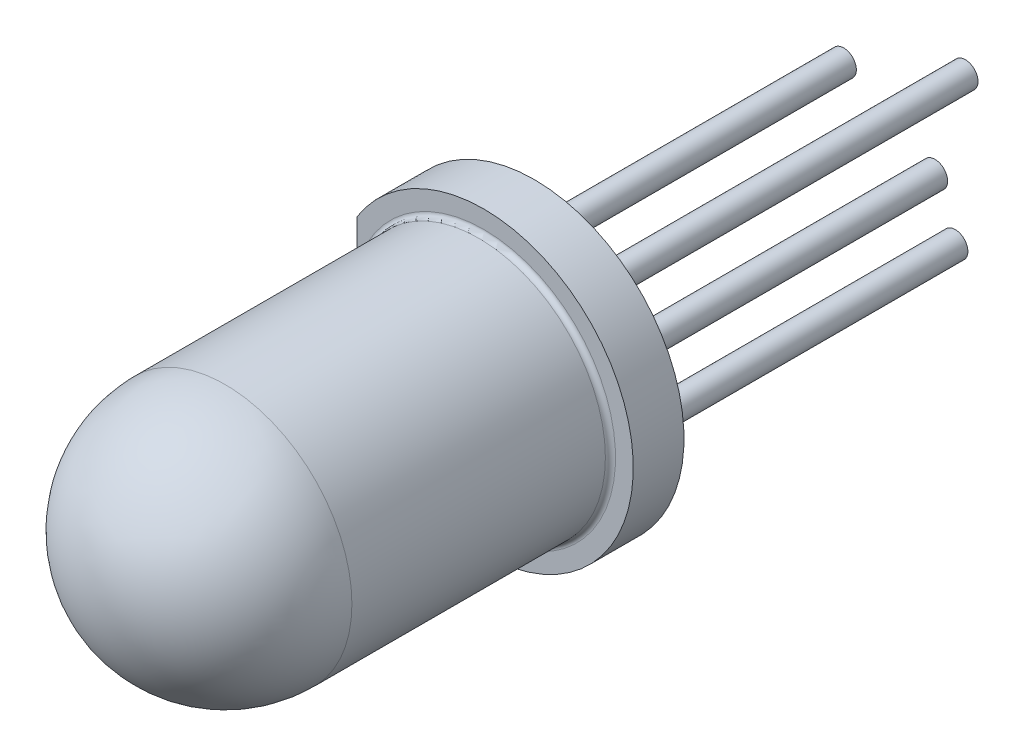
ISO-10303-21;
HEADER;
FILE_DESCRIPTION(('STEP AP214'),'2;1');
FILE_NAME('part.step','',(''),(''),'','','');
FILE_SCHEMA(('AUTOMOTIVE_DESIGN { 1 0 10303 214 1 1 1 1 }'));
ENDSEC;
DATA;
#1=APPLICATION_CONTEXT('core data for automotive mechanical design processes');
#2=APPLICATION_PROTOCOL_DEFINITION('international standard','automotive_design',2000,#1);
#3=PRODUCT_CONTEXT('',#1,'mechanical');
#4=PRODUCT('Part','Part','',(#3));
#5=PRODUCT_RELATED_PRODUCT_CATEGORY('part','',(#4));
#6=PRODUCT_DEFINITION_FORMATION('','',#4);
#7=PRODUCT_DEFINITION_CONTEXT('part definition',#1,'design');
#8=PRODUCT_DEFINITION('design','',#6,#7);
#9=PRODUCT_DEFINITION_SHAPE('','',#8);
#10=(LENGTH_UNIT() NAMED_UNIT(*) SI_UNIT(.MILLI.,.METRE.));
#11=(NAMED_UNIT(*) PLANE_ANGLE_UNIT() SI_UNIT($,.RADIAN.));
#12=(NAMED_UNIT(*) SI_UNIT($,.STERADIAN.) SOLID_ANGLE_UNIT());
#13=UNCERTAINTY_MEASURE_WITH_UNIT(LENGTH_MEASURE(1.E-05),#10,'distance_accuracy_value','');
#14=(GEOMETRIC_REPRESENTATION_CONTEXT(3) GLOBAL_UNCERTAINTY_ASSIGNED_CONTEXT((#13)) GLOBAL_UNIT_ASSIGNED_CONTEXT((#10,
#11,#12)) REPRESENTATION_CONTEXT('',''));
#15=CARTESIAN_POINT('',(0.,0.,0.));
#16=DIRECTION('',(0.,0.,1.));
#17=DIRECTION('',(1.,0.,0.));
#18=AXIS2_PLACEMENT_3D('',#15,#16,#17);
#19=CARTESIAN_POINT('',(-1.9,0.,-9.));
#20=DIRECTION('',(0.,0.,1.));
#21=DIRECTION('',(1.,0.,0.));
#22=AXIS2_PLACEMENT_3D('',#19,#20,#21);
#23=PLANE('',#22);
#24=CARTESIAN_POINT('',(-1.9,0.,-9.));
#25=DIRECTION('',(0.,0.,-1.));
#26=DIRECTION('',(-1.,0.,0.));
#27=AXIS2_PLACEMENT_3D('',#24,#25,#26);
#28=CIRCLE('',#27,0.25);
#29=CARTESIAN_POINT('',(-2.15,0.,-9.));
#30=VERTEX_POINT('',#29);
#31=EDGE_CURVE('E23',#30,#30,#28,.F.);
#32=ORIENTED_EDGE('',*,*,#31,.F.);
#33=EDGE_LOOP('',(#32));
#34=FACE_BOUND('',#33,.T.);
#35=ADVANCED_FACE('F16',(#34),#23,.F.);
#36=CARTESIAN_POINT('',(-0.500000688156753,-0.00138810605967266,-10.));
#37=DIRECTION('',(0.,0.,1.));
#38=DIRECTION('',(1.,0.,0.));
#39=AXIS2_PLACEMENT_3D('',#36,#37,#38);
#40=PLANE('',#39);
#41=CARTESIAN_POINT('',(-0.500000688156752,-0.00138810605967266,-10.));
#42=DIRECTION('',(0.,0.,-1.));
#43=DIRECTION('',(-1.,0.,0.));
#44=AXIS2_PLACEMENT_3D('',#41,#42,#43);
#45=CIRCLE('',#44,0.25);
#46=CARTESIAN_POINT('',(-0.750000688156752,-0.00138810605967266,-10.));
#47=VERTEX_POINT('',#46);
#48=EDGE_CURVE('E149',#47,#47,#45,.F.);
#49=ORIENTED_EDGE('',*,*,#48,.F.);
#50=EDGE_LOOP('',(#49));
#51=FACE_BOUND('',#50,.T.);
#52=ADVANCED_FACE('F220',(#51),#40,.F.);
#53=CARTESIAN_POINT('',(0.899998623686495,-0.00277621211934524,-8.));
#54=DIRECTION('',(0.,0.,1.));
#55=DIRECTION('',(1.,0.,0.));
#56=AXIS2_PLACEMENT_3D('',#53,#54,#55);
#57=PLANE('',#56);
#58=CARTESIAN_POINT('',(0.899998623686495,-0.00277621211934524,-8.));
#59=DIRECTION('',(0.,0.,-1.));
#60=DIRECTION('',(-1.,0.,0.));
#61=AXIS2_PLACEMENT_3D('',#58,#59,#60);
#62=CIRCLE('',#61,0.25);
#63=CARTESIAN_POINT('',(0.649998623686495,-0.00277621211934524,-8.));
#64=VERTEX_POINT('',#63);
#65=EDGE_CURVE('E147',#64,#64,#62,.F.);
#66=ORIENTED_EDGE('',*,*,#65,.F.);
#67=EDGE_LOOP('',(#66));
#68=FACE_BOUND('',#67,.T.);
#69=ADVANCED_FACE('F224',(#68),#57,.F.);
#70=CARTESIAN_POINT('',(2.29999862368649,-0.00277621211934511,-7.));
#71=DIRECTION('',(0.,0.,1.));
#72=DIRECTION('',(1.,0.,0.));
#73=AXIS2_PLACEMENT_3D('',#70,#71,#72);
#74=PLANE('',#73);
#75=CARTESIAN_POINT('',(2.29999862368649,-0.0027762121193451,-7.));
#76=DIRECTION('',(0.,0.,-1.));
#77=DIRECTION('',(-1.,0.,0.));
#78=AXIS2_PLACEMENT_3D('',#75,#76,#77);
#79=CIRCLE('',#78,0.25);
#80=CARTESIAN_POINT('',(2.04999862368649,-0.0027762121193451,-7.));
#81=VERTEX_POINT('',#80);
#82=EDGE_CURVE('E144',#81,#81,#79,.F.);
#83=ORIENTED_EDGE('',*,*,#82,.F.);
#84=EDGE_LOOP('',(#83));
#85=FACE_BOUND('',#84,.T.);
#86=ADVANCED_FACE('F228',(#85),#74,.F.);
#87=CARTESIAN_POINT('',(-2.5,-1.56604597633658,0.));
#88=DIRECTION('',(-1.,0.,0.));
#89=DIRECTION('',(0.,-1.,0.));
#90=AXIS2_PLACEMENT_3D('',#87,#88,#89);
#91=PLANE('',#90);
#92=DIRECTION('',(0.,1.,0.));
#93=VECTOR('',#92,1.);
#94=CARTESIAN_POINT('',(-2.5,0.,-1.));
#95=LINE('',#94,#93);
#96=CARTESIAN_POINT('',(-2.5,1.56604597633658,-1.));
#97=VERTEX_POINT('',#96);
#98=CARTESIAN_POINT('',(-2.5,-1.56604597633658,-1.));
#99=VERTEX_POINT('',#98);
#100=EDGE_CURVE('E143',#97,#99,#95,.F.);
#101=ORIENTED_EDGE('',*,*,#100,.T.);
#102=DIRECTION('',(0.,0.,1.));
#103=VECTOR('',#102,1.);
#104=CARTESIAN_POINT('',(-2.5,-1.56604597633658,0.));
#105=LINE('',#104,#103);
#106=CARTESIAN_POINT('',(-2.5,-1.56604597633658,0.));
#107=VERTEX_POINT('',#106);
#108=EDGE_CURVE('E55',#99,#107,#105,.T.);
#109=ORIENTED_EDGE('',*,*,#108,.T.);
#110=DIRECTION('',(0.,-1.,0.));
#111=VECTOR('',#110,1.);
#112=CARTESIAN_POINT('',(-2.5,-1.56604597633658,0.));
#113=LINE('',#112,#111);
#114=CARTESIAN_POINT('',(-2.5,-0.714142842854283,0.));
#115=VERTEX_POINT('',#114);
#116=EDGE_CURVE('E91',#107,#115,#113,.F.);
#117=ORIENTED_EDGE('',*,*,#116,.T.);
#118=DIRECTION('',(0.,-1.,0.));
#119=VECTOR('',#118,1.);
#120=CARTESIAN_POINT('',(-2.5,-1.56604597633658,0.));
#121=LINE('',#120,#119);
#122=CARTESIAN_POINT('',(-2.5,0.,0.));
#123=VERTEX_POINT('',#122);
#124=EDGE_CURVE('E85',#115,#123,#121,.F.);
#125=ORIENTED_EDGE('',*,*,#124,.T.);
#126=DIRECTION('',(0.,-1.,0.));
#127=VECTOR('',#126,1.);
#128=CARTESIAN_POINT('',(-2.5,-1.56604597633658,0.));
#129=LINE('',#128,#127);
#130=CARTESIAN_POINT('',(-2.5,0.714142842854284,0.));
#131=VERTEX_POINT('',#130);
#132=EDGE_CURVE('E82',#123,#131,#129,.F.);
#133=ORIENTED_EDGE('',*,*,#132,.T.);
#134=DIRECTION('',(0.,-1.,0.));
#135=VECTOR('',#134,1.);
#136=CARTESIAN_POINT('',(-2.5,-1.56604597633658,0.));
#137=LINE('',#136,#135);
#138=CARTESIAN_POINT('',(-2.5,1.56604597633658,0.));
#139=VERTEX_POINT('',#138);
#140=EDGE_CURVE('E109',#131,#139,#137,.F.);
#141=ORIENTED_EDGE('',*,*,#140,.T.);
#142=DIRECTION('',(0.,0.,1.));
#143=VECTOR('',#142,1.);
#144=CARTESIAN_POINT('',(-2.5,1.56604597633658,0.));
#145=LINE('',#144,#143);
#146=EDGE_CURVE('E61',#139,#97,#145,.F.);
#147=ORIENTED_EDGE('',*,*,#146,.T.);
#148=EDGE_LOOP('',(#101,#109,#117,#125,#133,#141,#147));
#149=FACE_BOUND('',#148,.T.);
#150=ADVANCED_FACE('F113',(#149),#91,.T.);
#151=CARTESIAN_POINT('',(-1.9,0.,0.));
#152=DIRECTION('',(0.,0.,-1.));
#153=DIRECTION('',(-1.,0.,0.));
#154=AXIS2_PLACEMENT_3D('',#151,#152,#153);
#155=CYLINDRICAL_SURFACE('',#154,0.25);
#156=CARTESIAN_POINT('',(-1.9,0.,-1.));
#157=DIRECTION('',(0.,0.,-1.));
#158=DIRECTION('',(-1.,0.,0.));
#159=AXIS2_PLACEMENT_3D('',#156,#157,#158);
#160=CIRCLE('',#159,0.25);
#161=CARTESIAN_POINT('',(-2.15,0.,-1.));
#162=VERTEX_POINT('',#161);
#163=EDGE_CURVE('E140',#162,#162,#160,.T.);
#164=ORIENTED_EDGE('',*,*,#163,.T.);
#165=EDGE_LOOP('',(#164));
#166=FACE_BOUND('',#165,.T.);
#167=ORIENTED_EDGE('',*,*,#31,.T.);
#168=EDGE_LOOP('',(#167));
#169=FACE_BOUND('',#168,.T.);
#170=ADVANCED_FACE('F235',(#166,#169),#155,.T.);
#171=CARTESIAN_POINT('',(-0.500000688156752,-0.00138810605967266,0.));
#172=DIRECTION('',(0.,0.,-1.));
#173=DIRECTION('',(-1.,0.,0.));
#174=AXIS2_PLACEMENT_3D('',#171,#172,#173);
#175=CYLINDRICAL_SURFACE('',#174,0.25);
#176=CARTESIAN_POINT('',(-0.500000688156752,-0.00138810605967266,-1.));
#177=DIRECTION('',(0.,0.,-1.));
#178=DIRECTION('',(-1.,0.,0.));
#179=AXIS2_PLACEMENT_3D('',#176,#177,#178);
#180=CIRCLE('',#179,0.25);
#181=CARTESIAN_POINT('',(-0.750000688156752,-0.00138810605967266,-1.));
#182=VERTEX_POINT('',#181);
#183=EDGE_CURVE('E137',#182,#182,#180,.T.);
#184=ORIENTED_EDGE('',*,*,#183,.T.);
#185=EDGE_LOOP('',(#184));
#186=FACE_BOUND('',#185,.T.);
#187=ORIENTED_EDGE('',*,*,#48,.T.);
#188=EDGE_LOOP('',(#187));
#189=FACE_BOUND('',#188,.T.);
#190=ADVANCED_FACE('F238',(#186,#189),#175,.T.);
#191=CARTESIAN_POINT('',(0.899998623686495,-0.00277621211934524,0.));
#192=DIRECTION('',(0.,0.,-1.));
#193=DIRECTION('',(-1.,0.,0.));
#194=AXIS2_PLACEMENT_3D('',#191,#192,#193);
#195=CYLINDRICAL_SURFACE('',#194,0.25);
#196=CARTESIAN_POINT('',(0.899998623686495,-0.00277621211934524,-1.));
#197=DIRECTION('',(0.,0.,-1.));
#198=DIRECTION('',(-1.,0.,0.));
#199=AXIS2_PLACEMENT_3D('',#196,#197,#198);
#200=CIRCLE('',#199,0.25);
#201=CARTESIAN_POINT('',(0.649998623686495,-0.00277621211934524,-1.));
#202=VERTEX_POINT('',#201);
#203=EDGE_CURVE('E134',#202,#202,#200,.T.);
#204=ORIENTED_EDGE('',*,*,#203,.T.);
#205=EDGE_LOOP('',(#204));
#206=FACE_BOUND('',#205,.T.);
#207=ORIENTED_EDGE('',*,*,#65,.T.);
#208=EDGE_LOOP('',(#207));
#209=FACE_BOUND('',#208,.T.);
#210=ADVANCED_FACE('F242',(#206,#209),#195,.T.);
#211=CARTESIAN_POINT('',(2.29999862368649,-0.0027762121193451,0.));
#212=DIRECTION('',(0.,0.,-1.));
#213=DIRECTION('',(-1.,0.,0.));
#214=AXIS2_PLACEMENT_3D('',#211,#212,#213);
#215=CYLINDRICAL_SURFACE('',#214,0.25);
#216=CARTESIAN_POINT('',(2.29999862368649,-0.0027762121193451,-1.));
#217=DIRECTION('',(0.,0.,-1.));
#218=DIRECTION('',(-1.,0.,0.));
#219=AXIS2_PLACEMENT_3D('',#216,#217,#218);
#220=CIRCLE('',#219,0.25);
#221=CARTESIAN_POINT('',(2.04999862368649,-0.0027762121193451,-1.));
#222=VERTEX_POINT('',#221);
#223=EDGE_CURVE('E131',#222,#222,#220,.T.);
#224=ORIENTED_EDGE('',*,*,#223,.T.);
#225=EDGE_LOOP('',(#224));
#226=FACE_BOUND('',#225,.T.);
#227=ORIENTED_EDGE('',*,*,#82,.T.);
#228=EDGE_LOOP('',(#227));
#229=FACE_BOUND('',#228,.T.);
#230=ADVANCED_FACE('F246',(#226,#229),#215,.T.);
#231=CARTESIAN_POINT('',(-0.0618571529879345,0.,-1.));
#232=DIRECTION('',(0.,0.,1.));
#233=DIRECTION('',(1.,0.,0.));
#234=AXIS2_PLACEMENT_3D('',#231,#232,#233);
#235=PLANE('',#234);
#236=ORIENTED_EDGE('',*,*,#223,.F.);
#237=EDGE_LOOP('',(#236));
#238=FACE_BOUND('',#237,.T.);
#239=ORIENTED_EDGE('',*,*,#203,.F.);
#240=EDGE_LOOP('',(#239));
#241=FACE_BOUND('',#240,.T.);
#242=ORIENTED_EDGE('',*,*,#183,.F.);
#243=EDGE_LOOP('',(#242));
#244=FACE_BOUND('',#243,.T.);
#245=ORIENTED_EDGE('',*,*,#163,.F.);
#246=EDGE_LOOP('',(#245));
#247=FACE_BOUND('',#246,.T.);
#248=CARTESIAN_POINT('',(0.,0.,-1.));
#249=DIRECTION('',(0.,0.,-1.));
#250=DIRECTION('',(-1.,0.,0.));
#251=AXIS2_PLACEMENT_3D('',#248,#249,#250);
#252=CIRCLE('',#251,2.95);
#253=EDGE_CURVE('E129',#99,#97,#252,.F.);
#254=ORIENTED_EDGE('',*,*,#253,.F.);
#255=ORIENTED_EDGE('',*,*,#100,.F.);
#256=EDGE_LOOP('',(#254,#255));
#257=FACE_BOUND('',#256,.T.);
#258=ADVANCED_FACE('F250',(#238,#241,#244,#247,#257),#235,.F.);
#259=CARTESIAN_POINT('',(0.,0.,0.));
#260=DIRECTION('',(0.,0.,-1.));
#261=DIRECTION('',(-1.,0.,0.));
#262=AXIS2_PLACEMENT_3D('',#259,#260,#261);
#263=CYLINDRICAL_SURFACE('',#262,2.95);
#264=ORIENTED_EDGE('',*,*,#253,.T.);
#265=ORIENTED_EDGE('',*,*,#146,.F.);
#266=CARTESIAN_POINT('',(0.,0.,0.));
#267=DIRECTION('',(0.,0.,-1.));
#268=DIRECTION('',(-1.,0.,0.));
#269=AXIS2_PLACEMENT_3D('',#266,#267,#268);
#270=CIRCLE('',#269,2.95);
#271=EDGE_CURVE('E110',#107,#139,#270,.F.);
#272=ORIENTED_EDGE('',*,*,#271,.F.);
#273=ORIENTED_EDGE('',*,*,#108,.F.);
#274=EDGE_LOOP('',(#264,#265,#272,#273));
#275=FACE_BOUND('',#274,.T.);
#276=ADVANCED_FACE('F253',(#275),#263,.T.);
#277=CARTESIAN_POINT('',(-0.0618571529879345,0.,0.));
#278=DIRECTION('',(0.,0.,1.));
#279=DIRECTION('',(1.,0.,0.));
#280=AXIS2_PLACEMENT_3D('',#277,#278,#279);
#281=PLANE('',#280);
#282=ORIENTED_EDGE('',*,*,#271,.T.);
#283=ORIENTED_EDGE('',*,*,#140,.F.);
#284=CARTESIAN_POINT('',(0.,0.,0.));
#285=DIRECTION('',(0.,0.,1.));
#286=DIRECTION('',(-0.961538461538462,-0.274670324174724,0.));
#287=AXIS2_PLACEMENT_3D('',#284,#285,#286);
#288=CIRCLE('',#287,2.6);
#289=EDGE_CURVE('E98',#131,#115,#288,.F.);
#290=ORIENTED_EDGE('',*,*,#289,.T.);
#291=ORIENTED_EDGE('',*,*,#116,.F.);
#292=EDGE_LOOP('',(#282,#283,#290,#291));
#293=FACE_BOUND('',#292,.T.);
#294=ADVANCED_FACE('F108',(#293),#281,.T.);
#295=CARTESIAN_POINT('',(-2.5,-0.714142842854282,0.));
#296=CARTESIAN_POINT('',(-2.5,-0.482023204548682,0.));
#297=CARTESIAN_POINT('',(-2.50000000000002,-0.243022455016443,0.));
#298=CARTESIAN_POINT('',(-2.5,-0.00411441959371261,0.));
#299=CARTESIAN_POINT('',(-2.5,-0.00205707543980342,0.));
#300=CARTESIAN_POINT('',(-2.5,0.,0.));
#301=CARTESIAN_POINT('',(-2.47123083650559,-0.705924725972507,0.));
#302=CARTESIAN_POINT('',(-2.48218266928474,-0.479895728531125,0.0196589434896165));
#303=CARTESIAN_POINT('',(-2.50033075854075,-0.241092176491023,0.00894969734497286));
#304=CARTESIAN_POINT('',(-2.4999957250898,-0.00408519950064266,0.000154493666085717));
#305=CARTESIAN_POINT('',(-2.5,-0.00204200529007337,7.68429875783755E-05));
#306=CARTESIAN_POINT('',(-2.5,0.,0.));
#307=CARTESIAN_POINT('',(-2.42136433127591,-0.691680002849334,0.0250619932520833));
#308=CARTESIAN_POINT('',(-2.46691547291197,-0.47568396203871,0.055375498424906));
#309=CARTESIAN_POINT('',(-2.49997506077096,-0.237738602029265,0.0242513260337589));
#310=CARTESIAN_POINT('',(-2.49999509972098,-0.0040339039891653,0.000427003856448805));
#311=CARTESIAN_POINT('',(-2.5,-0.00201563252804577,0.000211318215840534));
#312=CARTESIAN_POINT('',(-2.5,0.,0.));
#313=CARTESIAN_POINT('',(-2.40384615384615,-0.68667581043681,0.0775600524743586));
#314=CARTESIAN_POINT('',(-2.46663828910914,-0.467457903872003,0.0865891904841458));
#315=CARTESIAN_POINT('',(-2.49954055252166,-0.234866011162775,0.0401965160544569));
#316=CARTESIAN_POINT('',(-2.49999704875697,-0.00397966786001214,0.000695626378417263));
#317=CARTESIAN_POINT('',(-2.5,-0.00198925976601819,0.000345793444102691));
#318=CARTESIAN_POINT('',(-2.5,0.,0.));
#319=CARTESIAN_POINT('',(-2.40384615384615,-0.68667581043681,0.1));
#320=CARTESIAN_POINT('',(-2.46760253014687,-0.463483850527579,0.1));
#321=CARTESIAN_POINT('',(-2.49946602825216,-0.23367543751808,0.0470277200575298));
#322=CARTESIAN_POINT('',(-2.49999756472572,-0.00395617268624521,0.00081076546662554));
#323=CARTESIAN_POINT('',(-2.5,-0.00197795715372065,0.000403425684786473));
#324=CARTESIAN_POINT('',(-2.5,0.,0.));
#325=B_SPLINE_SURFACE_WITH_KNOTS('',3,3,((#295,#296,#297,#298,#299,#300),(#301,#302,#303,#304,
#305,#306),(#307,#308,#309,#310,#311,#312),(#313,#314,#315,#316,#317,#318),(#319,#320,#321,#322,
#323,#324)),.UNSPECIFIED.,.F.,.F.,.F.,(4,1,4),(4,2,4),(0.,0.571428571428571,1.),
(0.140083179452767,0.212504506604115,0.21313338586216),.UNSPECIFIED.);
#326=CARTESIAN_POINT('',(-2.40384615384615,-0.68667581043681,0.1));
#327=CARTESIAN_POINT('',(-2.46760253014687,-0.463483850527579,0.1));
#328=CARTESIAN_POINT('',(-2.49946602825216,-0.23367543751808,0.0470277200575298));
#329=CARTESIAN_POINT('',(-2.49999756472572,-0.00395617268624521,0.00081076546662554));
#330=CARTESIAN_POINT('',(-2.5,-0.00197795715372065,0.000403425684786473));
#331=CARTESIAN_POINT('',(-2.5,0.,0.));
#332=B_SPLINE_CURVE_WITH_KNOTS('',3,(#326,#327,#328,#329,#330,#331),.UNSPECIFIED.,.F.,.F.,(4,2,
4),(0.140083179452767,0.212504506604115,0.21313338586216),.UNSPECIFIED.);
#333=CARTESIAN_POINT('',(-2.40384615384615,-0.686675810436811,0.1));
#334=VERTEX_POINT('',#333);
#335=EDGE_CURVE('E88',#123,#334,#332,.F.);
#336=CARTESIAN_POINT('',(-2.5,-0.714142842854282,0.));
#337=CARTESIAN_POINT('',(-2.47123083650559,-0.705924725972507,0.));
#338=CARTESIAN_POINT('',(-2.42136433127591,-0.691680002849334,0.0250619932520833));
#339=CARTESIAN_POINT('',(-2.40384615384615,-0.68667581043681,0.0775600524743586));
#340=CARTESIAN_POINT('',(-2.40384615384615,-0.68667581043681,0.1));
#341=B_SPLINE_CURVE_WITH_KNOTS('',3,(#336,#337,#338,#339,#340),.UNSPECIFIED.,.F.,.F.,(4,1,4),
(0.,0.571428571428571,1.),.UNSPECIFIED.);
#342=EDGE_CURVE('E69',#115,#334,#341,.T.);
#343=ORIENTED_EDGE('',*,*,#335,.F.);
#344=ORIENTED_EDGE('',*,*,#124,.F.);
#345=ORIENTED_EDGE('',*,*,#342,.T.);
#346=EDGE_LOOP('',(#343,#344,#345));
#347=FACE_BOUND('',#346,.T.);
#348=ADVANCED_FACE('F86',(#347),#325,.T.);
#349=CARTESIAN_POINT('',(0.,0.,0.1));
#350=DIRECTION('',(0.,0.,-1.));
#351=DIRECTION('',(-1.,0.,0.));
#352=AXIS2_PLACEMENT_3D('',#349,#350,#351);
#353=TOROIDAL_SURFACE('',#352,2.6,0.1);
#354=CARTESIAN_POINT('',(0.,0.,0.1));
#355=DIRECTION('',(0.,0.,1.));
#356=DIRECTION('',(1.,0.,0.));
#357=AXIS2_PLACEMENT_3D('',#354,#355,#356);
#358=CIRCLE('',#357,2.5);
#359=CARTESIAN_POINT('',(-2.40384615384615,0.686675810436812,0.099999999988369));
#360=VERTEX_POINT('',#359);
#361=EDGE_CURVE('E101',#334,#360,#358,.T.);
#362=ORIENTED_EDGE('',*,*,#361,.F.);
#363=ORIENTED_EDGE('',*,*,#342,.F.);
#364=ORIENTED_EDGE('',*,*,#289,.F.);
#365=CARTESIAN_POINT('',(-2.40384615384615,0.686675810436812,0.1));
#366=CARTESIAN_POINT('',(-2.40384615384615,0.686675810436812,0.0476401224401701));
#367=CARTESIAN_POINT('',(-2.44965396388478,0.699761138311177,0.));
#368=CARTESIAN_POINT('',(-2.5,0.714142842854285,0.));
#369=B_SPLINE_CURVE_WITH_KNOTS('',3,(#365,#366,#367,#368),.UNSPECIFIED.,.F.,.F.,(4,4),(0.,1.),.UNSPECIFIED.);
#370=EDGE_CURVE('E102',#360,#131,#369,.T.);
#371=ORIENTED_EDGE('',*,*,#370,.F.);
#372=EDGE_LOOP('',(#362,#363,#364,#371));
#373=FACE_BOUND('',#372,.T.);
#374=ADVANCED_FACE('F97',(#373),#353,.F.);
#375=CARTESIAN_POINT('',(-2.5,0.,0.));
#376=CARTESIAN_POINT('',(-2.5,0.0020570754398724,0.));
#377=CARTESIAN_POINT('',(-2.5,0.00411441959365886,0.));
#378=CARTESIAN_POINT('',(-2.50000000000002,0.243022455016887,0.));
#379=CARTESIAN_POINT('',(-2.5,0.482023204548646,0.));
#380=CARTESIAN_POINT('',(-2.5,0.714142842854285,0.));
#381=CARTESIAN_POINT('',(-2.5,0.,0.));
#382=CARTESIAN_POINT('',(-2.50006033015493,0.00201413032138561,0.000117065746382435));
#383=CARTESIAN_POINT('',(-2.49993795833086,0.00407815221962409,0.000286365637176124));
#384=CARTESIAN_POINT('',(-2.50148579395016,0.239438003206356,0.0153550731016766));
#385=CARTESIAN_POINT('',(-2.47197192444689,0.477060200929653,0.0326572127412467));
#386=CARTESIAN_POINT('',(-2.44965396388478,0.699761138311177,0.));
#387=CARTESIAN_POINT('',(-2.5,0.,0.));
#388=CARTESIAN_POINT('',(-2.50001212315686,0.00198248298867692,0.000265599671497545));
#389=CARTESIAN_POINT('',(-2.49998540233388,0.0040306443893593,0.00054520782893619));
#390=CARTESIAN_POINT('',(-2.49981104887682,0.236172898879302,0.0310200019940715));
#391=CARTESIAN_POINT('',(-2.46570808388032,0.471250807425999,0.0688421356822733));
#392=CARTESIAN_POINT('',(-2.40384615384615,0.686675810436812,0.0476401224401701));
#393=CARTESIAN_POINT('',(-2.5,0.,0.));
#394=CARTESIAN_POINT('',(-2.5,0.00197795715382185,0.000403425684714604));
#395=CARTESIAN_POINT('',(-2.49999756472572,0.00395617268619358,0.000810765466560878));
#396=CARTESIAN_POINT('',(-2.49946602825219,0.233675437518508,0.0470277200580625));
#397=CARTESIAN_POINT('',(-2.46760253014688,0.463483850527544,0.1));
#398=CARTESIAN_POINT('',(-2.40384615384615,0.686675810436812,0.1));
#399=B_SPLINE_SURFACE_WITH_KNOTS('',3,3,((#375,#376,#377,#378,#379,#380),(#381,#382,#383,#384,
#385,#386),(#387,#388,#389,#390,#391,#392),(#393,#394,#395,#396,#397,#398)),.UNSPECIFIED.,.F.,
.F.,.F.,(4,4),(4,2,4),(0.,1.),(-0.000628879258033287,0.,0.0724213271513591),.UNSPECIFIED.);
#400=CARTESIAN_POINT('',(-2.5,0.,0.));
#401=CARTESIAN_POINT('',(-2.50000000000001,0.00197795715382688,0.000403425684561524));
#402=CARTESIAN_POINT('',(-2.49999756472571,0.0039561726862763,0.00081076546626593));
#403=CARTESIAN_POINT('',(-2.49946602825257,0.233675437521282,0.0470277200402831));
#404=CARTESIAN_POINT('',(-2.46760253014478,0.463483850536171,0.0999999999653938));
#405=CARTESIAN_POINT('',(-2.40384615384615,0.686675810436812,0.0999999999418452));
#406=B_SPLINE_CURVE_WITH_KNOTS('',3,(#400,#401,#402,#403,#404,#405),.UNSPECIFIED.,.F.,.F.,(4,2,
4),(-0.000628879258033287,0.,0.0724213271513591),.UNSPECIFIED.);
#407=EDGE_CURVE('E284',#360,#123,#406,.F.);
#408=ORIENTED_EDGE('',*,*,#132,.F.);
#409=ORIENTED_EDGE('',*,*,#407,.F.);
#410=ORIENTED_EDGE('',*,*,#370,.T.);
#411=EDGE_LOOP('',(#408,#409,#410));
#412=FACE_BOUND('',#411,.T.);
#413=ADVANCED_FACE('F18',(#412),#399,.T.);
#414=CARTESIAN_POINT('',(0.,0.,5.1));
#415=DIRECTION('',(1.,0.,0.));
#416=DIRECTION('',(0.,1.,0.));
#417=AXIS2_PLACEMENT_3D('',#414,#415,#416);
#418=SPHERICAL_SURFACE('',#417,2.5);
#419=CARTESIAN_POINT('',(0.,0.,5.1));
#420=DIRECTION('',(0.,0.,1.));
#421=DIRECTION('',(1.,0.,0.));
#422=AXIS2_PLACEMENT_3D('',#419,#420,#421);
#423=CIRCLE('',#422,2.5);
#424=CARTESIAN_POINT('',(-2.5,0.,5.1));
#425=VERTEX_POINT('',#424);
#426=CARTESIAN_POINT('',(2.5,0.,5.1));
#427=VERTEX_POINT('',#426);
#428=EDGE_CURVE('E10',#425,#427,#423,.F.);
#429=ORIENTED_EDGE('',*,*,#428,.F.);
#430=CARTESIAN_POINT('',(0.,0.,5.1));
#431=DIRECTION('',(0.,0.,1.));
#432=DIRECTION('',(1.,0.,0.));
#433=AXIS2_PLACEMENT_3D('',#430,#431,#432);
#434=CIRCLE('',#433,2.5);
#435=EDGE_CURVE('E29',#427,#425,#434,.F.);
#436=ORIENTED_EDGE('',*,*,#435,.F.);
#437=EDGE_LOOP('',(#429,#436));
#438=FACE_BOUND('',#437,.T.);
#439=ADVANCED_FACE('F171',(#438),#418,.T.);
#440=CARTESIAN_POINT('',(0.,0.,0.));
#441=DIRECTION('',(0.,0.,1.));
#442=DIRECTION('',(1.,0.,0.));
#443=AXIS2_PLACEMENT_3D('',#440,#441,#442);
#444=CYLINDRICAL_SURFACE('',#443,2.5);
#445=ORIENTED_EDGE('',*,*,#428,.T.);
#446=ORIENTED_EDGE('',*,*,#435,.T.);
#447=EDGE_LOOP('',(#445,#446));
#448=FACE_BOUND('',#447,.T.);
#449=ORIENTED_EDGE('',*,*,#361,.T.);
#450=ORIENTED_EDGE('',*,*,#407,.T.);
#451=ORIENTED_EDGE('',*,*,#335,.T.);
#452=EDGE_LOOP('',(#449,#450,#451));
#453=FACE_BOUND('',#452,.T.);
#454=ADVANCED_FACE('F260',(#448,#453),#444,.T.);
#455=CLOSED_SHELL('',(#35,#52,#69,#86,#150,#170,#190,#210,#230,#258,#276,#294,#348,#374,#413,
#439,#454));
#456=MANIFOLD_SOLID_BREP('B1',#455);
#457=ADVANCED_BREP_SHAPE_REPRESENTATION('',(#18,#456),#14);
#458=SHAPE_DEFINITION_REPRESENTATION(#9,#457);
ENDSEC;
END-ISO-10303-21;
